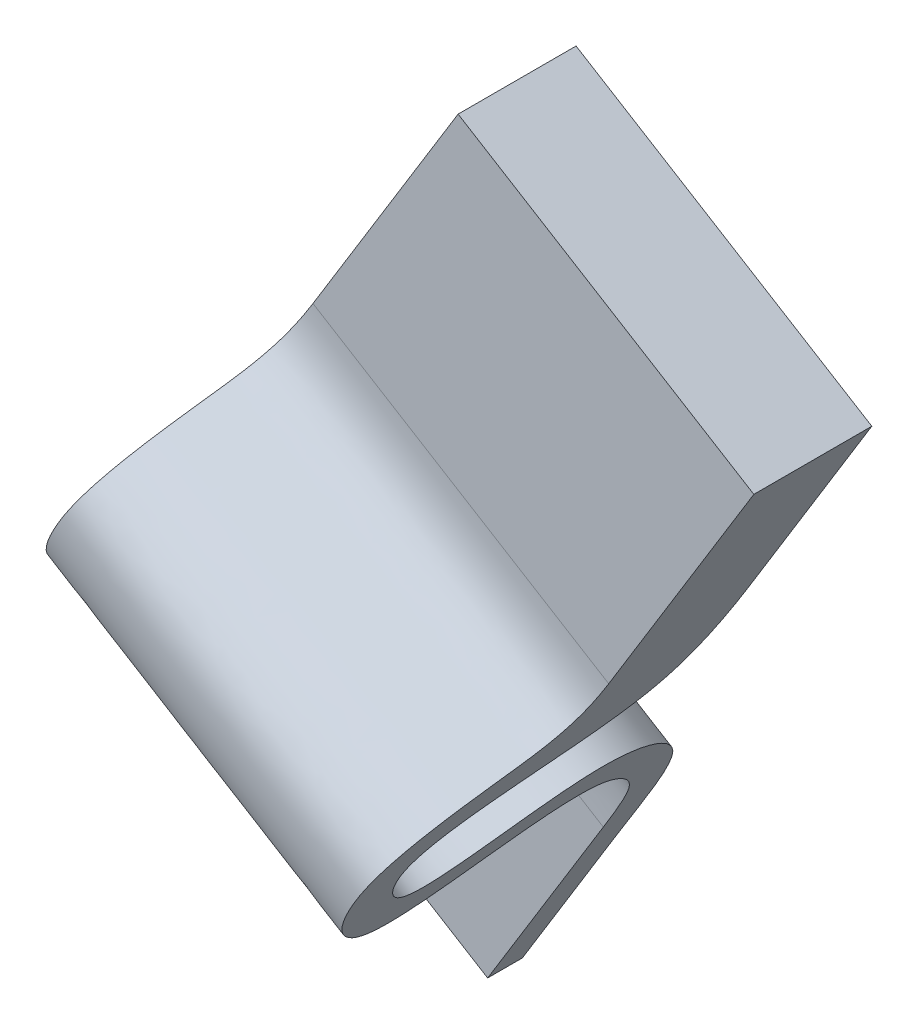
ISO-10303-21;
HEADER;
FILE_DESCRIPTION(('STEP AP214'),'2;1');
FILE_NAME('part.step','',(''),(''),'','','');
FILE_SCHEMA(('AUTOMOTIVE_DESIGN { 1 0 10303 214 1 1 1 1 }'));
ENDSEC;
DATA;
#1=APPLICATION_CONTEXT('core data for automotive mechanical design processes');
#2=APPLICATION_PROTOCOL_DEFINITION('international standard','automotive_design',2000,#1);
#3=PRODUCT_CONTEXT('',#1,'mechanical');
#4=PRODUCT('Part','Part','',(#3));
#5=PRODUCT_RELATED_PRODUCT_CATEGORY('part','',(#4));
#6=PRODUCT_DEFINITION_FORMATION('','',#4);
#7=PRODUCT_DEFINITION_CONTEXT('part definition',#1,'design');
#8=PRODUCT_DEFINITION('design','',#6,#7);
#9=PRODUCT_DEFINITION_SHAPE('','',#8);
#10=(LENGTH_UNIT() NAMED_UNIT(*) SI_UNIT(.MILLI.,.METRE.));
#11=(NAMED_UNIT(*) PLANE_ANGLE_UNIT() SI_UNIT($,.RADIAN.));
#12=(NAMED_UNIT(*) SI_UNIT($,.STERADIAN.) SOLID_ANGLE_UNIT());
#13=UNCERTAINTY_MEASURE_WITH_UNIT(LENGTH_MEASURE(1.E-05),#10,'distance_accuracy_value','');
#14=(GEOMETRIC_REPRESENTATION_CONTEXT(3) GLOBAL_UNCERTAINTY_ASSIGNED_CONTEXT((#13)) GLOBAL_UNIT_ASSIGNED_CONTEXT((#10,
#11,#12)) REPRESENTATION_CONTEXT('',''));
#15=CARTESIAN_POINT('',(0.,0.,0.));
#16=DIRECTION('',(0.,0.,1.));
#17=DIRECTION('',(1.,0.,0.));
#18=AXIS2_PLACEMENT_3D('',#15,#16,#17);
#19=CARTESIAN_POINT('',(57.9476042823606,-8.12635661401931,24.2));
#20=DIRECTION('',(0.,0.,-1.));
#21=DIRECTION('',(0.522918964785246,0.852382400257025,0.));
#22=AXIS2_PLACEMENT_3D('',#19,#20,#21);
#23=PLANE('',#22);
#24=DIRECTION('',(-0.522918964785246,-0.852382400257025,0.));
#25=VECTOR('',#24,1.);
#26=CARTESIAN_POINT('',(53.6856922810755,-5.51176179009308,24.2));
#27=LINE('',#26,#25);
#28=CARTESIAN_POINT('',(55.7773681402165,-2.10223218906498,24.2));
#29=VERTEX_POINT('',#28);
#30=CARTESIAN_POINT('',(53.6856922810755,-5.51176179009308,24.2));
#31=VERTEX_POINT('',#30);
#32=EDGE_CURVE('E137',#29,#31,#27,.T.);
#33=ORIENTED_EDGE('',*,*,#32,.T.);
#34=DIRECTION('',(-0.852382400257025,0.522918964785246,0.));
#35=VECTOR('',#34,1.);
#36=CARTESIAN_POINT('',(57.9476042823606,-8.12635661401931,24.2));
#37=LINE('',#36,#35);
#38=CARTESIAN_POINT('',(57.9476042823606,-8.12635661401931,24.2));
#39=VERTEX_POINT('',#38);
#40=EDGE_CURVE('E11',#39,#31,#37,.T.);
#41=ORIENTED_EDGE('',*,*,#40,.F.);
#42=DIRECTION('',(-0.522918964785246,-0.852382400257025,0.));
#43=VECTOR('',#42,1.);
#44=CARTESIAN_POINT('',(57.9476042823606,-8.12635661401931,24.2));
#45=LINE('',#44,#43);
#46=CARTESIAN_POINT('',(60.0392801415016,-4.71682701299121,24.2));
#47=VERTEX_POINT('',#46);
#48=EDGE_CURVE('E161',#47,#39,#45,.T.);
#49=ORIENTED_EDGE('',*,*,#48,.F.);
#50=DIRECTION('',(-0.852382400257025,0.522918964785246,0.));
#51=VECTOR('',#50,1.);
#52=CARTESIAN_POINT('',(60.0392801415016,-4.71682701299121,24.2));
#53=LINE('',#52,#51);
#54=EDGE_CURVE('E130',#47,#29,#53,.T.);
#55=ORIENTED_EDGE('',*,*,#54,.T.);
#56=EDGE_LOOP('',(#33,#41,#49,#55));
#57=FACE_BOUND('',#56,.T.);
#58=ADVANCED_FACE('F38',(#57),#23,.F.);
#59=CARTESIAN_POINT('',(57.9476042823606,-8.12635661401931,24.2));
#60=CARTESIAN_POINT('',(57.4760312621394,-8.89504272016891,24.2));
#61=CARTESIAN_POINT('',(57.3059294411046,-9.17231665411642,25.1499042849272));
#62=CARTESIAN_POINT('',(56.7503518190845,-10.0779341950313,26.937273651454));
#63=CARTESIAN_POINT('',(55.1301903789686,-12.7188732126036,25.3823309711682));
#64=CARTESIAN_POINT('',(56.4016768458582,-10.6462907294138,23.078008634809));
#65=CARTESIAN_POINT('',(55.7525913387389,-11.7043305019005,21.5756636497059));
#66=CARTESIAN_POINT('',(55.4863386876906,-12.138334791396,21.5));
#67=CARTESIAN_POINT('',(55.1698751260201,-12.6541852165215,21.5));
#68=B_SPLINE_CURVE_WITH_KNOTS('',3,(#59,#60,#61,#62,#63,#64,#65,#66,#67),.UNSPECIFIED.,.F.,.F.,
(4,1,1,1,1,1,4),(0.,0.158274358466955,0.31394071702856,0.500197607196337,0.811095350732164,
0.87635563100651,1.),.UNSPECIFIED.);
#69=DIRECTION('',(-0.852382400257025,0.522918964785246,0.));
#70=VECTOR('',#69,1.);
#71=SURFACE_OF_LINEAR_EXTRUSION('',#68,#70);
#72=CARTESIAN_POINT('',(53.6856922810755,-5.51176179009308,24.2));
#73=CARTESIAN_POINT('',(53.2141192608543,-6.28044789624268,24.2));
#74=CARTESIAN_POINT('',(53.0440174398195,-6.55772183019019,25.1499042849272));
#75=CARTESIAN_POINT('',(52.4884398177994,-7.4633393711051,26.937273651454));
#76=CARTESIAN_POINT('',(50.8682783776835,-10.1042783886773,25.3823309711682));
#77=CARTESIAN_POINT('',(52.1397648445731,-8.03169590548755,23.078008634809));
#78=CARTESIAN_POINT('',(51.4906793374538,-9.08973567797423,21.5756636497059));
#79=CARTESIAN_POINT('',(51.2244266864055,-9.52373996746977,21.5));
#80=CARTESIAN_POINT('',(50.9079631247349,-10.0395903925952,21.5));
#81=B_SPLINE_CURVE_WITH_KNOTS('',3,(#72,#73,#74,#75,#76,#77,#78,#79,#80),.UNSPECIFIED.,.F.,.F.,
(4,1,1,1,1,1,4),(0.,0.158274358466955,0.31394071702856,0.500197607196337,0.811095350732164,
0.87635563100651,1.),.UNSPECIFIED.);
#82=CARTESIAN_POINT('',(50.9079631247349,-10.0395903925952,21.5));
#83=VERTEX_POINT('',#82);
#84=EDGE_CURVE('E140',#31,#83,#81,.T.);
#85=ORIENTED_EDGE('',*,*,#84,.T.);
#86=DIRECTION('',(-0.852382400257025,0.522918964785246,0.));
#87=VECTOR('',#86,1.);
#88=CARTESIAN_POINT('',(55.1698751260201,-12.6541852165215,21.5));
#89=LINE('',#88,#87);
#90=CARTESIAN_POINT('',(55.1698751260201,-12.6541852165215,21.5));
#91=VERTEX_POINT('',#90);
#92=EDGE_CURVE('E46',#91,#83,#89,.T.);
#93=ORIENTED_EDGE('',*,*,#92,.F.);
#94=EDGE_CURVE('E97',#39,#91,#68,.T.);
#95=ORIENTED_EDGE('',*,*,#94,.F.);
#96=ORIENTED_EDGE('',*,*,#40,.T.);
#97=EDGE_LOOP('',(#85,#93,#95,#96));
#98=FACE_BOUND('',#97,.T.);
#99=ADVANCED_FACE('F199',(#98),#71,.F.);
#100=CARTESIAN_POINT('',(55.1698751260201,-12.6541852165215,21.5));
#101=DIRECTION('',(0.,0.,-1.));
#102=DIRECTION('',(0.522918964785246,0.852382400257025,0.));
#103=AXIS2_PLACEMENT_3D('',#100,#101,#102);
#104=PLANE('',#103);
#105=DIRECTION('',(-0.522918964785246,-0.852382400257025,0.));
#106=VECTOR('',#105,1.);
#107=CARTESIAN_POINT('',(50.9079631247349,-10.0395903925952,21.5));
#108=LINE('',#107,#106);
#109=CARTESIAN_POINT('',(49.2408810804009,-12.7570121922778,21.5));
#110=VERTEX_POINT('',#109);
#111=EDGE_CURVE('E144',#83,#110,#108,.T.);
#112=ORIENTED_EDGE('',*,*,#111,.T.);
#113=DIRECTION('',(-0.852382400257025,0.522918964785246,0.));
#114=VECTOR('',#113,1.);
#115=CARTESIAN_POINT('',(53.502793081686,-15.371607016204,21.5));
#116=LINE('',#115,#114);
#117=CARTESIAN_POINT('',(53.502793081686,-15.371607016204,21.5));
#118=VERTEX_POINT('',#117);
#119=EDGE_CURVE('E168',#118,#110,#116,.T.);
#120=ORIENTED_EDGE('',*,*,#119,.F.);
#121=DIRECTION('',(-0.522918964785246,-0.852382400257025,0.));
#122=VECTOR('',#121,1.);
#123=CARTESIAN_POINT('',(55.1698751260201,-12.6541852165215,21.5));
#124=LINE('',#123,#122);
#125=EDGE_CURVE('E176',#91,#118,#124,.T.);
#126=ORIENTED_EDGE('',*,*,#125,.F.);
#127=ORIENTED_EDGE('',*,*,#92,.T.);
#128=EDGE_LOOP('',(#112,#120,#126,#127));
#129=FACE_BOUND('',#128,.T.);
#130=ADVANCED_FACE('F174',(#129),#104,.F.);
#131=CARTESIAN_POINT('',(53.502793081686,-15.371607016204,21.5));
#132=DIRECTION('',(0.522918964785246,0.852382400257025,0.));
#133=DIRECTION('',(0.,0.,1.));
#134=AXIS2_PLACEMENT_3D('',#131,#132,#133);
#135=PLANE('',#134);
#136=DIRECTION('',(0.,0.,-1.));
#137=VECTOR('',#136,1.);
#138=CARTESIAN_POINT('',(49.2408810804009,-12.7570121922778,21.5));
#139=LINE('',#138,#137);
#140=CARTESIAN_POINT('',(49.2408810804009,-12.7570121922778,21.));
#141=VERTEX_POINT('',#140);
#142=EDGE_CURVE('E149',#110,#141,#139,.T.);
#143=ORIENTED_EDGE('',*,*,#142,.T.);
#144=DIRECTION('',(-0.852382400257025,0.522918964785246,0.));
#145=VECTOR('',#144,1.);
#146=CARTESIAN_POINT('',(53.502793081686,-15.371607016204,21.));
#147=LINE('',#146,#145);
#148=CARTESIAN_POINT('',(53.502793081686,-15.371607016204,21.));
#149=VERTEX_POINT('',#148);
#150=EDGE_CURVE('E165',#149,#141,#147,.T.);
#151=ORIENTED_EDGE('',*,*,#150,.F.);
#152=DIRECTION('',(0.,0.,-1.));
#153=VECTOR('',#152,1.);
#154=CARTESIAN_POINT('',(53.502793081686,-15.371607016204,21.5));
#155=LINE('',#154,#153);
#156=EDGE_CURVE('E188',#118,#149,#155,.T.);
#157=ORIENTED_EDGE('',*,*,#156,.F.);
#158=ORIENTED_EDGE('',*,*,#119,.T.);
#159=EDGE_LOOP('',(#143,#151,#157,#158));
#160=FACE_BOUND('',#159,.T.);
#161=ADVANCED_FACE('F184',(#160),#135,.F.);
#162=CARTESIAN_POINT('',(53.502793081686,-15.371607016204,21.));
#163=DIRECTION('',(0.,0.,1.));
#164=DIRECTION('',(-0.522918964785246,-0.852382400257025,0.));
#165=AXIS2_PLACEMENT_3D('',#162,#163,#164);
#166=PLANE('',#165);
#167=DIRECTION('',(0.522918964785246,0.852382400257025,0.));
#168=VECTOR('',#167,1.);
#169=CARTESIAN_POINT('',(49.2408810804009,-12.7570121922778,21.));
#170=LINE('',#169,#168);
#171=CARTESIAN_POINT('',(50.548178492364,-10.6260561916352,21.));
#172=VERTEX_POINT('',#171);
#173=EDGE_CURVE('E151',#141,#172,#170,.T.);
#174=ORIENTED_EDGE('',*,*,#173,.T.);
#175=DIRECTION('',(-0.852382400257025,0.522918964785246,0.));
#176=VECTOR('',#175,1.);
#177=CARTESIAN_POINT('',(54.8100904936491,-13.2406510155615,21.));
#178=LINE('',#177,#176);
#179=CARTESIAN_POINT('',(54.8100904936491,-13.2406510155615,21.));
#180=VERTEX_POINT('',#179);
#181=EDGE_CURVE('E125',#180,#172,#178,.T.);
#182=ORIENTED_EDGE('',*,*,#181,.F.);
#183=DIRECTION('',(0.522918964785246,0.852382400257025,0.));
#184=VECTOR('',#183,1.);
#185=CARTESIAN_POINT('',(53.502793081686,-15.371607016204,21.));
#186=LINE('',#185,#184);
#187=EDGE_CURVE('E116',#149,#180,#186,.T.);
#188=ORIENTED_EDGE('',*,*,#187,.F.);
#189=ORIENTED_EDGE('',*,*,#150,.T.);
#190=EDGE_LOOP('',(#174,#182,#188,#189));
#191=FACE_BOUND('',#190,.T.);
#192=ADVANCED_FACE('F187',(#191),#166,.F.);
#193=CARTESIAN_POINT('',(54.8100904936491,-13.2406510155615,21.));
#194=CARTESIAN_POINT('',(55.2539441720025,-12.5171487347193,21.));
#195=CARTESIAN_POINT('',(55.907930950049,-11.4511196611006,20.82312486855));
#196=CARTESIAN_POINT('',(56.7126013545157,-10.1394692200867,23.0336945382925));
#197=CARTESIAN_POINT('',(55.6438055750843,-11.8816563909621,25.1416591503825));
#198=CARTESIAN_POINT('',(56.7438933913507,-10.0884617346778,26.0765074891618));
#199=CARTESIAN_POINT('',(57.0617409854039,-9.57035527195604,24.3236314858341));
#200=CARTESIAN_POINT('',(57.2615650791602,-9.24463264161476,22.5920220387189));
#201=CARTESIAN_POINT('',(58.0117605481555,-8.02177889641395,22.5));
#202=CARTESIAN_POINT('',(58.2973373550067,-7.55627532803302,22.5));
#203=B_SPLINE_CURVE_WITH_KNOTS('',3,(#193,#194,#195,#196,#197,#198,#199,#200,#201,#202),
.UNSPECIFIED.,.F.,.F.,(4,1,1,1,1,1,1,4),(0.,0.172351126917197,0.305283380055242,
0.526149232155901,0.596117834535038,0.721321629479893,0.864477500134806,1.),.UNSPECIFIED.);
#204=DIRECTION('',(-0.852382400257025,0.522918964785246,0.));
#205=VECTOR('',#204,1.);
#206=SURFACE_OF_LINEAR_EXTRUSION('',#203,#205);
#207=CARTESIAN_POINT('',(50.548178492364,-10.6260561916352,21.));
#208=CARTESIAN_POINT('',(50.9920321707174,-9.90255391079305,21.));
#209=CARTESIAN_POINT('',(51.6460189487639,-8.8365248371744,20.82312486855));
#210=CARTESIAN_POINT('',(52.4506893532306,-7.52487439616043,23.0336945382925));
#211=CARTESIAN_POINT('',(51.3818935737992,-9.26706156703583,25.1416591503825));
#212=CARTESIAN_POINT('',(52.4819813900656,-7.47386691075152,26.0765074891618));
#213=CARTESIAN_POINT('',(52.7998289841188,-6.95576044802981,24.3236314858341));
#214=CARTESIAN_POINT('',(52.9996530778751,-6.63003781768853,22.5920220387189));
#215=CARTESIAN_POINT('',(53.7498485468704,-5.40718407248771,22.5));
#216=CARTESIAN_POINT('',(54.0354253537216,-4.94168050410679,22.5));
#217=B_SPLINE_CURVE_WITH_KNOTS('',3,(#207,#208,#209,#210,#211,#212,#213,#214,#215,#216),
.UNSPECIFIED.,.F.,.F.,(4,1,1,1,1,1,1,4),(0.,0.172351126917197,0.305283380055242,
0.526149232155901,0.596117834535038,0.721321629479893,0.864477500134806,1.),.UNSPECIFIED.);
#218=CARTESIAN_POINT('',(54.0354253537216,-4.94168050410679,22.5));
#219=VERTEX_POINT('',#218);
#220=EDGE_CURVE('E124',#172,#219,#217,.T.);
#221=ORIENTED_EDGE('',*,*,#220,.T.);
#222=DIRECTION('',(-0.852382400257025,0.522918964785246,0.));
#223=VECTOR('',#222,1.);
#224=CARTESIAN_POINT('',(58.2973373550067,-7.55627532803302,22.5));
#225=LINE('',#224,#223);
#226=CARTESIAN_POINT('',(58.2973373550067,-7.55627532803302,22.5));
#227=VERTEX_POINT('',#226);
#228=EDGE_CURVE('E121',#227,#219,#225,.T.);
#229=ORIENTED_EDGE('',*,*,#228,.F.);
#230=EDGE_CURVE('E110',#180,#227,#203,.T.);
#231=ORIENTED_EDGE('',*,*,#230,.F.);
#232=ORIENTED_EDGE('',*,*,#181,.T.);
#233=EDGE_LOOP('',(#221,#229,#231,#232));
#234=FACE_BOUND('',#233,.T.);
#235=ADVANCED_FACE('F122',(#234),#206,.F.);
#236=CARTESIAN_POINT('',(60.0392801415016,-4.71682701299121,22.5));
#237=DIRECTION('',(0.,0.,1.));
#238=DIRECTION('',(-0.522918964785246,-0.852382400257025,0.));
#239=AXIS2_PLACEMENT_3D('',#236,#237,#238);
#240=PLANE('',#239);
#241=DIRECTION('',(0.522918964785246,0.852382400257025,0.));
#242=VECTOR('',#241,1.);
#243=CARTESIAN_POINT('',(55.7773681402165,-2.10223218906498,22.5));
#244=LINE('',#243,#242);
#245=CARTESIAN_POINT('',(55.7773681402165,-2.10223218906498,22.5));
#246=VERTEX_POINT('',#245);
#247=EDGE_CURVE('E83',#219,#246,#244,.T.);
#248=ORIENTED_EDGE('',*,*,#247,.T.);
#249=DIRECTION('',(-0.852382400257025,0.522918964785246,0.));
#250=VECTOR('',#249,1.);
#251=CARTESIAN_POINT('',(60.0392801415016,-4.71682701299121,22.5));
#252=LINE('',#251,#250);
#253=CARTESIAN_POINT('',(60.0392801415016,-4.71682701299121,22.5));
#254=VERTEX_POINT('',#253);
#255=EDGE_CURVE('E126',#254,#246,#252,.T.);
#256=ORIENTED_EDGE('',*,*,#255,.F.);
#257=DIRECTION('',(0.522918964785246,0.852382400257025,0.));
#258=VECTOR('',#257,1.);
#259=CARTESIAN_POINT('',(60.0392801415016,-4.71682701299121,22.5));
#260=LINE('',#259,#258);
#261=EDGE_CURVE('E114',#227,#254,#260,.T.);
#262=ORIENTED_EDGE('',*,*,#261,.F.);
#263=ORIENTED_EDGE('',*,*,#228,.T.);
#264=EDGE_LOOP('',(#248,#256,#262,#263));
#265=FACE_BOUND('',#264,.T.);
#266=ADVANCED_FACE('F128',(#265),#240,.F.);
#267=CARTESIAN_POINT('',(60.0392801415016,-4.71682701299121,24.2));
#268=DIRECTION('',(-0.522918964785246,-0.852382400257025,0.));
#269=DIRECTION('',(0.,0.,-1.));
#270=AXIS2_PLACEMENT_3D('',#267,#268,#269);
#271=PLANE('',#270);
#272=DIRECTION('',(0.,0.,1.));
#273=VECTOR('',#272,1.);
#274=CARTESIAN_POINT('',(55.7773681402165,-2.10223218906498,24.2));
#275=LINE('',#274,#273);
#276=EDGE_CURVE('E89',#246,#29,#275,.T.);
#277=ORIENTED_EDGE('',*,*,#276,.T.);
#278=ORIENTED_EDGE('',*,*,#54,.F.);
#279=DIRECTION('',(0.,0.,1.));
#280=VECTOR('',#279,1.);
#281=CARTESIAN_POINT('',(60.0392801415016,-4.71682701299121,24.2));
#282=LINE('',#281,#280);
#283=EDGE_CURVE('E54',#254,#47,#282,.T.);
#284=ORIENTED_EDGE('',*,*,#283,.F.);
#285=ORIENTED_EDGE('',*,*,#255,.T.);
#286=EDGE_LOOP('',(#277,#278,#284,#285));
#287=FACE_BOUND('',#286,.T.);
#288=ADVANCED_FACE('F212',(#287),#271,.F.);
#289=CARTESIAN_POINT('',(56.0539192728308,-11.2131518585113,25.1887730280457));
#290=DIRECTION('',(0.852382400257025,-0.522918964785246,0.));
#291=DIRECTION('',(-0.522918964785246,-0.852382400257025,0.));
#292=AXIS2_PLACEMENT_3D('',#289,#290,#291);
#293=PLANE('',#292);
#294=ORIENTED_EDGE('',*,*,#48,.T.);
#295=ORIENTED_EDGE('',*,*,#94,.T.);
#296=ORIENTED_EDGE('',*,*,#125,.T.);
#297=ORIENTED_EDGE('',*,*,#156,.T.);
#298=ORIENTED_EDGE('',*,*,#187,.T.);
#299=ORIENTED_EDGE('',*,*,#230,.T.);
#300=ORIENTED_EDGE('',*,*,#261,.T.);
#301=ORIENTED_EDGE('',*,*,#283,.T.);
#302=EDGE_LOOP('',(#294,#295,#296,#297,#298,#299,#300,#301));
#303=FACE_BOUND('',#302,.T.);
#304=ADVANCED_FACE('F112',(#303),#293,.T.);
#305=CARTESIAN_POINT('',(51.7920072715456,-8.59855703458506,25.1887730280457));
#306=DIRECTION('',(0.852382400257025,-0.522918964785246,0.));
#307=DIRECTION('',(-0.522918964785246,-0.852382400257025,0.));
#308=AXIS2_PLACEMENT_3D('',#305,#306,#307);
#309=PLANE('',#308);
#310=ORIENTED_EDGE('',*,*,#32,.F.);
#311=ORIENTED_EDGE('',*,*,#276,.F.);
#312=ORIENTED_EDGE('',*,*,#247,.F.);
#313=ORIENTED_EDGE('',*,*,#220,.F.);
#314=ORIENTED_EDGE('',*,*,#173,.F.);
#315=ORIENTED_EDGE('',*,*,#142,.F.);
#316=ORIENTED_EDGE('',*,*,#111,.F.);
#317=ORIENTED_EDGE('',*,*,#84,.F.);
#318=EDGE_LOOP('',(#310,#311,#312,#313,#314,#315,#316,#317));
#319=FACE_BOUND('',#318,.T.);
#320=ADVANCED_FACE('F180',(#319),#309,.F.);
#321=CLOSED_SHELL('',(#58,#99,#130,#161,#192,#235,#266,#288,#304,#320));
#322=MANIFOLD_SOLID_BREP('B2',#321);
#323=ADVANCED_BREP_SHAPE_REPRESENTATION('',(#18,#322),#14);
#324=SHAPE_DEFINITION_REPRESENTATION(#9,#323);
ENDSEC;
END-ISO-10303-21;
